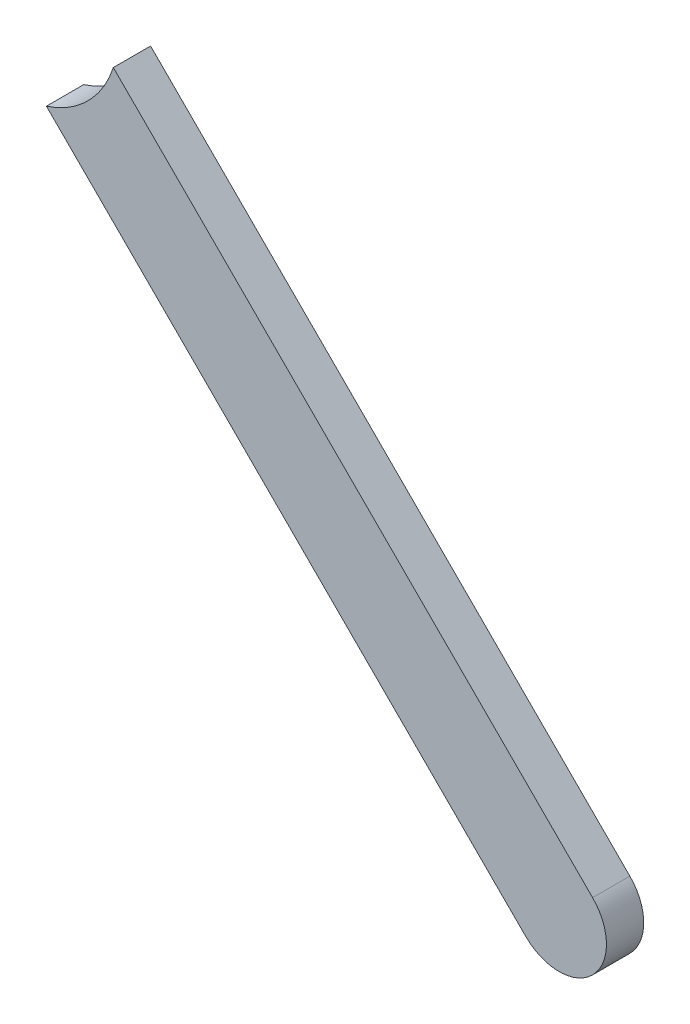
ISO-10303-21;
HEADER;
FILE_DESCRIPTION(('STEP AP214'),'2;1');
FILE_NAME('part.step','',(''),(''),'','','');
FILE_SCHEMA(('AUTOMOTIVE_DESIGN { 1 0 10303 214 1 1 1 1 }'));
ENDSEC;
DATA;
#1=APPLICATION_CONTEXT('core data for automotive mechanical design processes');
#2=APPLICATION_PROTOCOL_DEFINITION('international standard','automotive_design',2000,#1);
#3=PRODUCT_CONTEXT('',#1,'mechanical');
#4=PRODUCT('Part','Part','',(#3));
#5=PRODUCT_RELATED_PRODUCT_CATEGORY('part','',(#4));
#6=PRODUCT_DEFINITION_FORMATION('','',#4);
#7=PRODUCT_DEFINITION_CONTEXT('part definition',#1,'design');
#8=PRODUCT_DEFINITION('design','',#6,#7);
#9=PRODUCT_DEFINITION_SHAPE('','',#8);
#10=(LENGTH_UNIT() NAMED_UNIT(*) SI_UNIT(.MILLI.,.METRE.));
#11=(NAMED_UNIT(*) PLANE_ANGLE_UNIT() SI_UNIT($,.RADIAN.));
#12=(NAMED_UNIT(*) SI_UNIT($,.STERADIAN.) SOLID_ANGLE_UNIT());
#13=UNCERTAINTY_MEASURE_WITH_UNIT(LENGTH_MEASURE(1.E-05),#10,'distance_accuracy_value','');
#14=(GEOMETRIC_REPRESENTATION_CONTEXT(3) GLOBAL_UNCERTAINTY_ASSIGNED_CONTEXT((#13)) GLOBAL_UNIT_ASSIGNED_CONTEXT((#10,
#11,#12)) REPRESENTATION_CONTEXT('',''));
#15=CARTESIAN_POINT('',(0.,0.,0.));
#16=DIRECTION('',(0.,0.,1.));
#17=DIRECTION('',(1.,0.,0.));
#18=AXIS2_PLACEMENT_3D('',#15,#16,#17);
#19=CARTESIAN_POINT('',(94.0223271411441,77.7004637788559,0.));
#20=DIRECTION('',(0.707106781186548,0.707106781186548,0.));
#21=DIRECTION('',(0.707106781186548,-0.707106781186548,0.));
#22=AXIS2_PLACEMENT_3D('',#19,#20,#21);
#23=PLANE('',#22);
#24=DIRECTION('',(0.707106781186548,-0.707106781186548,0.));
#25=VECTOR('',#24,1.);
#26=CARTESIAN_POINT('',(93.67339406,78.04939686,0.1999996));
#27=LINE('',#26,#25);
#28=CARTESIAN_POINT('',(94.0223271411441,77.7004637788559,0.1999996));
#29=VERTEX_POINT('',#28);
#30=CARTESIAN_POINT('',(96.59439406,75.12839686,0.1999996));
#31=VERTEX_POINT('',#30);
#32=EDGE_CURVE('E11',#29,#31,#27,.T.);
#33=ORIENTED_EDGE('',*,*,#32,.F.);
#34=DIRECTION('',(0.,0.,1.));
#35=VECTOR('',#34,1.);
#36=CARTESIAN_POINT('',(94.0223271411441,77.7004637788559,0.));
#37=LINE('',#36,#35);
#38=CARTESIAN_POINT('',(94.0223271411441,77.7004637788559,0.));
#39=VERTEX_POINT('',#38);
#40=EDGE_CURVE('E24',#39,#29,#37,.T.);
#41=ORIENTED_EDGE('',*,*,#40,.F.);
#42=DIRECTION('',(0.707106781186548,-0.707106781186548,0.));
#43=VECTOR('',#42,1.);
#44=CARTESIAN_POINT('',(93.67339406,78.04939686,0.));
#45=LINE('',#44,#43);
#46=CARTESIAN_POINT('',(96.59439406,75.12839686,0.));
#47=VERTEX_POINT('',#46);
#48=EDGE_CURVE('E75',#39,#47,#45,.T.);
#49=ORIENTED_EDGE('',*,*,#48,.T.);
#50=DIRECTION('',(0.,0.,1.));
#51=VECTOR('',#50,1.);
#52=CARTESIAN_POINT('',(96.59439406,75.12839686,0.));
#53=LINE('',#52,#51);
#54=EDGE_CURVE('E37',#47,#31,#53,.T.);
#55=ORIENTED_EDGE('',*,*,#54,.T.);
#56=EDGE_LOOP('',(#33,#41,#49,#55));
#57=FACE_BOUND('',#56,.T.);
#58=ADVANCED_FACE('F17',(#57),#23,.F.);
#59=CARTESIAN_POINT('',(96.774,75.3080028,0.));
#60=DIRECTION('',(0.,0.,-1.));
#61=DIRECTION('',(-0.707106781186548,-0.707106781186548,0.));
#62=AXIS2_PLACEMENT_3D('',#59,#60,#61);
#63=CYLINDRICAL_SURFACE('',#62,0.254001156230764);
#64=CARTESIAN_POINT('',(96.774,75.3080028,0.1999996));
#65=DIRECTION('',(0.,0.,1.));
#66=DIRECTION('',(-0.707106781186548,-0.707106781186548,0.));
#67=AXIS2_PLACEMENT_3D('',#64,#65,#66);
#68=CIRCLE('',#67,0.254001156230764);
#69=CARTESIAN_POINT('',(96.95360594,75.48760874,0.1999996));
#70=VERTEX_POINT('',#69);
#71=EDGE_CURVE('E83',#31,#70,#68,.T.);
#72=ORIENTED_EDGE('',*,*,#71,.F.);
#73=ORIENTED_EDGE('',*,*,#54,.F.);
#74=CARTESIAN_POINT('',(96.774,75.3080028,0.));
#75=DIRECTION('',(0.,0.,1.));
#76=DIRECTION('',(-0.707106781186548,-0.707106781186548,0.));
#77=AXIS2_PLACEMENT_3D('',#74,#75,#76);
#78=CIRCLE('',#77,0.254001156230764);
#79=CARTESIAN_POINT('',(96.95360594,75.48760874,0.));
#80=VERTEX_POINT('',#79);
#81=EDGE_CURVE('E81',#47,#80,#78,.T.);
#82=ORIENTED_EDGE('',*,*,#81,.T.);
#83=DIRECTION('',(0.,0.,1.));
#84=VECTOR('',#83,1.);
#85=CARTESIAN_POINT('',(96.95360594,75.48760874,0.));
#86=LINE('',#85,#84);
#87=EDGE_CURVE('E67',#80,#70,#86,.T.);
#88=ORIENTED_EDGE('',*,*,#87,.T.);
#89=EDGE_LOOP('',(#72,#73,#82,#88));
#90=FACE_BOUND('',#89,.T.);
#91=ADVANCED_FACE('F89',(#90),#63,.T.);
#92=CARTESIAN_POINT('',(96.95360594,75.48760874,0.));
#93=DIRECTION('',(-0.707106781186548,-0.707106781186548,0.));
#94=DIRECTION('',(-0.707106781186548,0.707106781186548,0.));
#95=AXIS2_PLACEMENT_3D('',#92,#93,#94);
#96=PLANE('',#95);
#97=DIRECTION('',(-0.707106781186548,0.707106781186548,0.));
#98=VECTOR('',#97,1.);
#99=CARTESIAN_POINT('',(96.95360594,75.48760874,0.1999996));
#100=LINE('',#99,#98);
#101=CARTESIAN_POINT('',(94.3815390211441,78.0596756588559,0.1999996));
#102=VERTEX_POINT('',#101);
#103=EDGE_CURVE('E71',#70,#102,#100,.T.);
#104=ORIENTED_EDGE('',*,*,#103,.F.);
#105=ORIENTED_EDGE('',*,*,#87,.F.);
#106=DIRECTION('',(-0.707106781186548,0.707106781186548,0.));
#107=VECTOR('',#106,1.);
#108=CARTESIAN_POINT('',(96.95360594,75.48760874,0.));
#109=LINE('',#108,#107);
#110=CARTESIAN_POINT('',(94.3815390211441,78.0596756588559,0.));
#111=VERTEX_POINT('',#110);
#112=EDGE_CURVE('E63',#80,#111,#109,.T.);
#113=ORIENTED_EDGE('',*,*,#112,.T.);
#114=DIRECTION('',(0.,0.,1.));
#115=VECTOR('',#114,1.);
#116=CARTESIAN_POINT('',(94.3815390211441,78.0596756588559,0.));
#117=LINE('',#116,#115);
#118=EDGE_CURVE('E53',#111,#102,#117,.T.);
#119=ORIENTED_EDGE('',*,*,#118,.T.);
#120=EDGE_LOOP('',(#104,#105,#113,#119));
#121=FACE_BOUND('',#120,.T.);
#122=ADVANCED_FACE('F66',(#121),#96,.F.);
#123=CARTESIAN_POINT('',(93.853,78.2290028,0.));
#124=DIRECTION('',(0.,0.,-1.));
#125=DIRECTION('',(1.,0.,0.));
#126=AXIS2_PLACEMENT_3D('',#123,#124,#125);
#127=CYLINDRICAL_SURFACE('',#126,0.55500016);
#128=ORIENTED_EDGE('',*,*,#40,.T.);
#129=CARTESIAN_POINT('',(93.853,78.2290028,0.1999996));
#130=DIRECTION('',(0.,0.,1.));
#131=DIRECTION('',(1.,0.,0.));
#132=AXIS2_PLACEMENT_3D('',#129,#130,#131);
#133=CIRCLE('',#132,0.55500016);
#134=EDGE_CURVE('E59',#29,#102,#133,.T.);
#135=ORIENTED_EDGE('',*,*,#134,.T.);
#136=ORIENTED_EDGE('',*,*,#118,.F.);
#137=CARTESIAN_POINT('',(93.853,78.2290028,0.));
#138=DIRECTION('',(0.,0.,1.));
#139=DIRECTION('',(1.,0.,0.));
#140=AXIS2_PLACEMENT_3D('',#137,#138,#139);
#141=CIRCLE('',#140,0.55500016);
#142=EDGE_CURVE('E57',#39,#111,#141,.T.);
#143=ORIENTED_EDGE('',*,*,#142,.F.);
#144=EDGE_LOOP('',(#128,#135,#136,#143));
#145=FACE_BOUND('',#144,.T.);
#146=ADVANCED_FACE('F55',(#145),#127,.F.);
#147=CARTESIAN_POINT('',(93.67339406,78.04939686,0.));
#148=DIRECTION('',(0.,0.,-1.));
#149=DIRECTION('',(-1.,0.,0.));
#150=AXIS2_PLACEMENT_3D('',#147,#148,#149);
#151=PLANE('',#150);
#152=ORIENTED_EDGE('',*,*,#48,.F.);
#153=ORIENTED_EDGE('',*,*,#142,.T.);
#154=ORIENTED_EDGE('',*,*,#112,.F.);
#155=ORIENTED_EDGE('',*,*,#81,.F.);
#156=EDGE_LOOP('',(#152,#153,#154,#155));
#157=FACE_BOUND('',#156,.T.);
#158=ADVANCED_FACE('F74',(#157),#151,.T.);
#159=CARTESIAN_POINT('',(93.67339406,78.04939686,0.1999996));
#160=DIRECTION('',(0.,0.,-1.));
#161=DIRECTION('',(-1.,0.,0.));
#162=AXIS2_PLACEMENT_3D('',#159,#160,#161);
#163=PLANE('',#162);
#164=ORIENTED_EDGE('',*,*,#134,.F.);
#165=ORIENTED_EDGE('',*,*,#32,.T.);
#166=ORIENTED_EDGE('',*,*,#71,.T.);
#167=ORIENTED_EDGE('',*,*,#103,.T.);
#168=EDGE_LOOP('',(#164,#165,#166,#167));
#169=FACE_BOUND('',#168,.T.);
#170=ADVANCED_FACE('F91',(#169),#163,.F.);
#171=CLOSED_SHELL('',(#58,#91,#122,#146,#158,#170));
#172=MANIFOLD_SOLID_BREP('B1',#171);
#173=ADVANCED_BREP_SHAPE_REPRESENTATION('',(#18,#172),#14);
#174=SHAPE_DEFINITION_REPRESENTATION(#9,#173);
ENDSEC;
END-ISO-10303-21;
